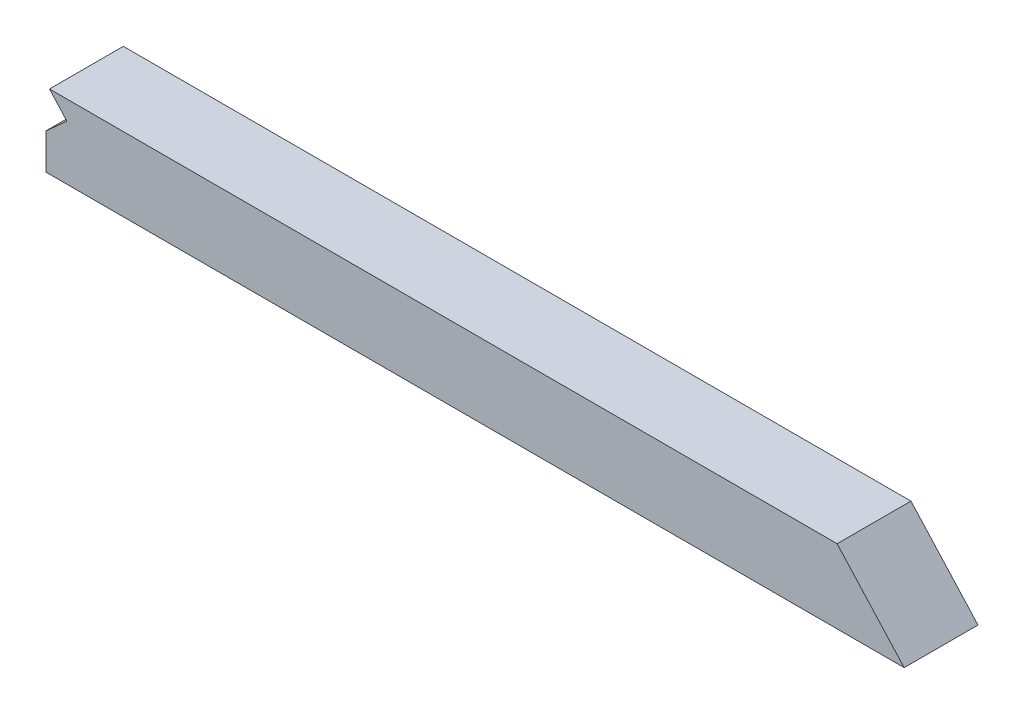
ISO-10303-21;
HEADER;
FILE_DESCRIPTION(('STEP AP214'),'2;1');
FILE_NAME('part.step','',(''),(''),'','','');
FILE_SCHEMA(('AUTOMOTIVE_DESIGN { 1 0 10303 214 1 1 1 1 }'));
ENDSEC;
DATA;
#1=APPLICATION_CONTEXT('core data for automotive mechanical design processes');
#2=APPLICATION_PROTOCOL_DEFINITION('international standard','automotive_design',2000,#1);
#3=PRODUCT_CONTEXT('',#1,'mechanical');
#4=PRODUCT('Part','Part','',(#3));
#5=PRODUCT_RELATED_PRODUCT_CATEGORY('part','',(#4));
#6=PRODUCT_DEFINITION_FORMATION('','',#4);
#7=PRODUCT_DEFINITION_CONTEXT('part definition',#1,'design');
#8=PRODUCT_DEFINITION('design','',#6,#7);
#9=PRODUCT_DEFINITION_SHAPE('','',#8);
#10=(LENGTH_UNIT() NAMED_UNIT(*) SI_UNIT(.MILLI.,.METRE.));
#11=(NAMED_UNIT(*) PLANE_ANGLE_UNIT() SI_UNIT($,.RADIAN.));
#12=(NAMED_UNIT(*) SI_UNIT($,.STERADIAN.) SOLID_ANGLE_UNIT());
#13=UNCERTAINTY_MEASURE_WITH_UNIT(LENGTH_MEASURE(1.E-05),#10,'distance_accuracy_value','');
#14=(GEOMETRIC_REPRESENTATION_CONTEXT(3) GLOBAL_UNCERTAINTY_ASSIGNED_CONTEXT((#13)) GLOBAL_UNIT_ASSIGNED_CONTEXT((#10,
#11,#12)) REPRESENTATION_CONTEXT('',''));
#15=CARTESIAN_POINT('',(0.,0.,0.));
#16=DIRECTION('',(0.,0.,1.));
#17=DIRECTION('',(1.,0.,0.));
#18=AXIS2_PLACEMENT_3D('',#15,#16,#17);
#19=CARTESIAN_POINT('',(442.976,19.05,-19.05));
#20=DIRECTION('',(0.,0.,1.));
#21=DIRECTION('',(0.,-1.,0.));
#22=AXIS2_PLACEMENT_3D('',#19,#20,#21);
#23=PLANE('',#22);
#24=DIRECTION('',(0.74294250709931,0.669355235390739,0.));
#25=VECTOR('',#24,1.);
#26=CARTESIAN_POINT('',(0.283182287971029,-0.314314653665926,-19.05));
#27=LINE('',#26,#25);
#28=CARTESIAN_POINT('',(0.,-0.569448187165578,-19.05));
#29=VERTEX_POINT('',#28);
#30=CARTESIAN_POINT('',(10.7563216177838,9.12147691082155,-19.05));
#31=VERTEX_POINT('',#30);
#32=EDGE_CURVE('E58',#29,#31,#27,.T.);
#33=ORIENTED_EDGE('',*,*,#32,.T.);
#34=DIRECTION('',(-0.66935523539074,0.742942507099309,0.));
#35=VECTOR('',#34,1.);
#36=CARTESIAN_POINT('',(10.4731393298128,9.43579156448748,-19.05));
#37=LINE('',#36,#35);
#38=CARTESIAN_POINT('',(1.81120292295173,19.05,-19.05));
#39=VERTEX_POINT('',#38);
#40=EDGE_CURVE('E113',#31,#39,#37,.T.);
#41=ORIENTED_EDGE('',*,*,#40,.T.);
#42=DIRECTION('',(-1.,0.,0.));
#43=VECTOR('',#42,1.);
#44=CARTESIAN_POINT('',(442.976,19.05,-19.05));
#45=LINE('',#44,#43);
#46=CARTESIAN_POINT('',(408.368396630119,19.05,-19.05));
#47=VERTEX_POINT('',#46);
#48=EDGE_CURVE('E11',#47,#39,#45,.T.);
#49=ORIENTED_EDGE('',*,*,#48,.F.);
#50=DIRECTION('',(0.672366807434664,-0.740218127486836,0.));
#51=VECTOR('',#50,1.);
#52=CARTESIAN_POINT('',(442.976,-19.05,-19.05));
#53=LINE('',#52,#51);
#54=CARTESIAN_POINT('',(442.976,-19.05,-19.05));
#55=VERTEX_POINT('',#54);
#56=EDGE_CURVE('E138',#47,#55,#53,.T.);
#57=ORIENTED_EDGE('',*,*,#56,.T.);
#58=DIRECTION('',(-1.,0.,0.));
#59=VECTOR('',#58,1.);
#60=CARTESIAN_POINT('',(442.976,-19.05,-19.05));
#61=LINE('',#60,#59);
#62=CARTESIAN_POINT('',(0.,-19.05,-19.05));
#63=VERTEX_POINT('',#62);
#64=EDGE_CURVE('E148',#55,#63,#61,.T.);
#65=ORIENTED_EDGE('',*,*,#64,.T.);
#66=DIRECTION('',(0.,1.,0.));
#67=VECTOR('',#66,1.);
#68=CARTESIAN_POINT('',(0.,19.05,-19.05));
#69=LINE('',#68,#67);
#70=EDGE_CURVE('E123',#63,#29,#69,.T.);
#71=ORIENTED_EDGE('',*,*,#70,.T.);
#72=EDGE_LOOP('',(#33,#41,#49,#57,#65,#71));
#73=FACE_BOUND('',#72,.T.);
#74=ADVANCED_FACE('F43',(#73),#23,.F.);
#75=CARTESIAN_POINT('',(442.976,19.05,19.05));
#76=DIRECTION('',(0.,-1.,0.));
#77=DIRECTION('',(0.,0.,-1.));
#78=AXIS2_PLACEMENT_3D('',#75,#76,#77);
#79=PLANE('',#78);
#80=ORIENTED_EDGE('',*,*,#48,.T.);
#81=DIRECTION('',(0.,0.,1.));
#82=VECTOR('',#81,1.);
#83=CARTESIAN_POINT('',(1.81120292295173,19.05,-19.05));
#84=LINE('',#83,#82);
#85=CARTESIAN_POINT('',(1.81120292295173,19.05,19.05));
#86=VERTEX_POINT('',#85);
#87=EDGE_CURVE('E109',#39,#86,#84,.T.);
#88=ORIENTED_EDGE('',*,*,#87,.T.);
#89=DIRECTION('',(-1.,0.,0.));
#90=VECTOR('',#89,1.);
#91=CARTESIAN_POINT('',(442.976,19.05,19.05));
#92=LINE('',#91,#90);
#93=CARTESIAN_POINT('',(408.368396630119,19.05,19.05));
#94=VERTEX_POINT('',#93);
#95=EDGE_CURVE('E51',#94,#86,#92,.T.);
#96=ORIENTED_EDGE('',*,*,#95,.F.);
#97=DIRECTION('',(0.,0.,1.));
#98=VECTOR('',#97,1.);
#99=CARTESIAN_POINT('',(408.368396630119,19.05,-19.05));
#100=LINE('',#99,#98);
#101=EDGE_CURVE('E141',#47,#94,#100,.T.);
#102=ORIENTED_EDGE('',*,*,#101,.F.);
#103=EDGE_LOOP('',(#80,#88,#96,#102));
#104=FACE_BOUND('',#103,.T.);
#105=ADVANCED_FACE('F168',(#104),#79,.F.);
#106=CARTESIAN_POINT('',(442.976,19.05,19.05));
#107=DIRECTION('',(0.,0.,-1.));
#108=DIRECTION('',(0.,1.,0.));
#109=AXIS2_PLACEMENT_3D('',#106,#107,#108);
#110=PLANE('',#109);
#111=ORIENTED_EDGE('',*,*,#95,.T.);
#112=DIRECTION('',(-0.66935523539074,0.742942507099309,0.));
#113=VECTOR('',#112,1.);
#114=CARTESIAN_POINT('',(10.4731393298128,9.43579156448748,19.05));
#115=LINE('',#114,#113);
#116=CARTESIAN_POINT('',(10.7563216177838,9.12147691082155,19.05));
#117=VERTEX_POINT('',#116);
#118=EDGE_CURVE('E125',#117,#86,#115,.T.);
#119=ORIENTED_EDGE('',*,*,#118,.F.);
#120=DIRECTION('',(0.74294250709931,0.669355235390739,0.));
#121=VECTOR('',#120,1.);
#122=CARTESIAN_POINT('',(0.283182287971029,-0.314314653665926,19.05));
#123=LINE('',#122,#121);
#124=CARTESIAN_POINT('',(0.,-0.569448187165577,19.05));
#125=VERTEX_POINT('',#124);
#126=EDGE_CURVE('E105',#125,#117,#123,.T.);
#127=ORIENTED_EDGE('',*,*,#126,.F.);
#128=DIRECTION('',(0.,-1.,0.));
#129=VECTOR('',#128,1.);
#130=CARTESIAN_POINT('',(0.,19.05,19.05));
#131=LINE('',#130,#129);
#132=CARTESIAN_POINT('',(0.,-19.05,19.05));
#133=VERTEX_POINT('',#132);
#134=EDGE_CURVE('E80',#125,#133,#131,.T.);
#135=ORIENTED_EDGE('',*,*,#134,.T.);
#136=DIRECTION('',(-1.,0.,0.));
#137=VECTOR('',#136,1.);
#138=CARTESIAN_POINT('',(442.976,-19.05,19.05));
#139=LINE('',#138,#137);
#140=CARTESIAN_POINT('',(442.976,-19.05,19.05));
#141=VERTEX_POINT('',#140);
#142=EDGE_CURVE('E158',#141,#133,#139,.T.);
#143=ORIENTED_EDGE('',*,*,#142,.F.);
#144=DIRECTION('',(0.672366807434664,-0.740218127486836,0.));
#145=VECTOR('',#144,1.);
#146=CARTESIAN_POINT('',(442.976,-19.05,19.05));
#147=LINE('',#146,#145);
#148=EDGE_CURVE('E67',#94,#141,#147,.T.);
#149=ORIENTED_EDGE('',*,*,#148,.F.);
#150=EDGE_LOOP('',(#111,#119,#127,#135,#143,#149));
#151=FACE_BOUND('',#150,.T.);
#152=ADVANCED_FACE('F165',(#151),#110,.F.);
#153=CARTESIAN_POINT('',(442.976,-19.05,19.05));
#154=DIRECTION('',(0.,1.,0.));
#155=DIRECTION('',(0.,0.,1.));
#156=AXIS2_PLACEMENT_3D('',#153,#154,#155);
#157=PLANE('',#156);
#158=DIRECTION('',(0.,0.,-1.));
#159=VECTOR('',#158,1.);
#160=CARTESIAN_POINT('',(0.,-19.05,19.05));
#161=LINE('',#160,#159);
#162=EDGE_CURVE('E149',#133,#63,#161,.T.);
#163=ORIENTED_EDGE('',*,*,#162,.T.);
#164=ORIENTED_EDGE('',*,*,#64,.F.);
#165=DIRECTION('',(0.,0.,-1.));
#166=VECTOR('',#165,1.);
#167=CARTESIAN_POINT('',(442.976,-19.05,19.05));
#168=LINE('',#167,#166);
#169=EDGE_CURVE('E85',#141,#55,#168,.T.);
#170=ORIENTED_EDGE('',*,*,#169,.F.);
#171=ORIENTED_EDGE('',*,*,#142,.T.);
#172=EDGE_LOOP('',(#163,#164,#170,#171));
#173=FACE_BOUND('',#172,.T.);
#174=ADVANCED_FACE('F172',(#173),#157,.F.);
#175=CARTESIAN_POINT('',(0.,0.,0.));
#176=DIRECTION('',(1.,0.,0.));
#177=DIRECTION('',(0.,0.,-1.));
#178=AXIS2_PLACEMENT_3D('',#175,#176,#177);
#179=PLANE('',#178);
#180=ORIENTED_EDGE('',*,*,#134,.F.);
#181=DIRECTION('',(0.,0.,1.));
#182=VECTOR('',#181,1.);
#183=CARTESIAN_POINT('',(0.,-0.569448187165577,-19.05));
#184=LINE('',#183,#182);
#185=EDGE_CURVE('E110',#29,#125,#184,.T.);
#186=ORIENTED_EDGE('',*,*,#185,.F.);
#187=ORIENTED_EDGE('',*,*,#70,.F.);
#188=ORIENTED_EDGE('',*,*,#162,.F.);
#189=EDGE_LOOP('',(#180,#186,#187,#188));
#190=FACE_BOUND('',#189,.T.);
#191=ADVANCED_FACE('F175',(#190),#179,.F.);
#192=CARTESIAN_POINT('',(442.976,-19.05,-19.05));
#193=DIRECTION('',(-0.740218127486836,-0.672366807434664,0.));
#194=DIRECTION('',(0.672366807434664,-0.740218127486836,0.));
#195=AXIS2_PLACEMENT_3D('',#192,#193,#194);
#196=PLANE('',#195);
#197=ORIENTED_EDGE('',*,*,#148,.T.);
#198=ORIENTED_EDGE('',*,*,#169,.T.);
#199=ORIENTED_EDGE('',*,*,#56,.F.);
#200=ORIENTED_EDGE('',*,*,#101,.T.);
#201=EDGE_LOOP('',(#197,#198,#199,#200));
#202=FACE_BOUND('',#201,.T.);
#203=ADVANCED_FACE('F169',(#202),#196,.F.);
#204=CARTESIAN_POINT('',(10.4731393298128,9.43579156448748,-19.05));
#205=DIRECTION('',(0.742942507099309,0.66935523539074,0.));
#206=DIRECTION('',(-0.66935523539074,0.742942507099309,0.));
#207=AXIS2_PLACEMENT_3D('',#204,#205,#206);
#208=PLANE('',#207);
#209=ORIENTED_EDGE('',*,*,#118,.T.);
#210=ORIENTED_EDGE('',*,*,#87,.F.);
#211=ORIENTED_EDGE('',*,*,#40,.F.);
#212=DIRECTION('',(0.,0.,1.));
#213=VECTOR('',#212,1.);
#214=CARTESIAN_POINT('',(10.7563216177838,9.12147691082155,-19.05));
#215=LINE('',#214,#213);
#216=EDGE_CURVE('E102',#31,#117,#215,.T.);
#217=ORIENTED_EDGE('',*,*,#216,.T.);
#218=EDGE_LOOP('',(#209,#210,#211,#217));
#219=FACE_BOUND('',#218,.T.);
#220=ADVANCED_FACE('F114',(#219),#208,.F.);
#221=CARTESIAN_POINT('',(0.283182287971029,-0.314314653665926,-19.05));
#222=DIRECTION('',(0.669355235390739,-0.74294250709931,0.));
#223=DIRECTION('',(0.74294250709931,0.669355235390739,0.));
#224=AXIS2_PLACEMENT_3D('',#221,#222,#223);
#225=PLANE('',#224);
#226=ORIENTED_EDGE('',*,*,#126,.T.);
#227=ORIENTED_EDGE('',*,*,#216,.F.);
#228=ORIENTED_EDGE('',*,*,#32,.F.);
#229=ORIENTED_EDGE('',*,*,#185,.T.);
#230=EDGE_LOOP('',(#226,#227,#228,#229));
#231=FACE_BOUND('',#230,.T.);
#232=ADVANCED_FACE('F104',(#231),#225,.F.);
#233=CLOSED_SHELL('',(#74,#105,#152,#174,#191,#203,#220,#232));
#234=MANIFOLD_SOLID_BREP('B2',#233);
#235=ADVANCED_BREP_SHAPE_REPRESENTATION('',(#18,#234),#14);
#236=SHAPE_DEFINITION_REPRESENTATION(#9,#235);
ENDSEC;
END-ISO-10303-21;
